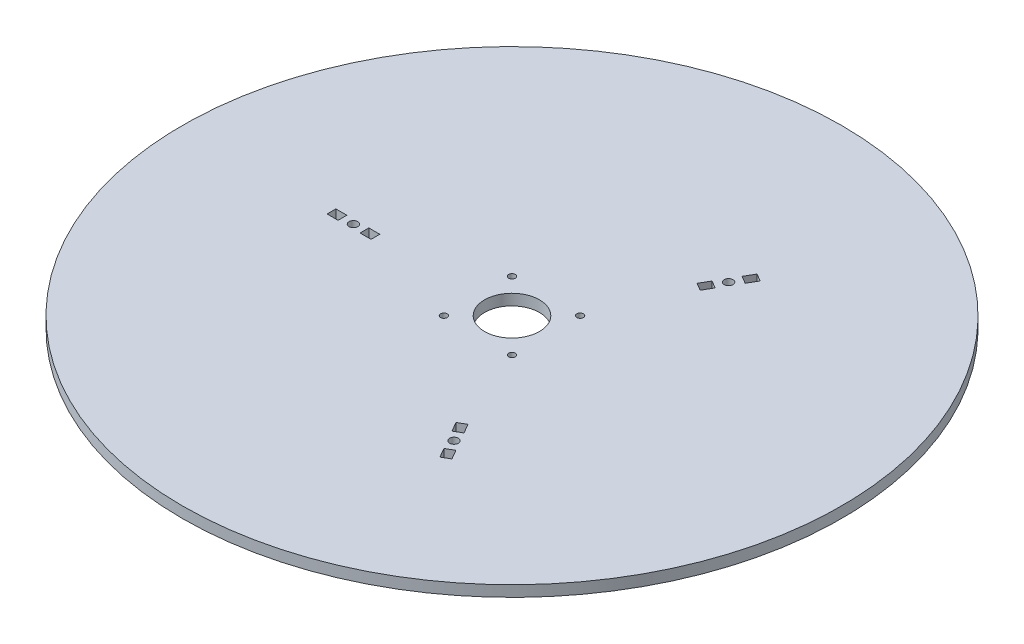
ISO-10303-21;
HEADER;
FILE_DESCRIPTION(('STEP AP214'),'2;1');
FILE_NAME('part.step','',(''),(''),'','','');
FILE_SCHEMA(('AUTOMOTIVE_DESIGN { 1 0 10303 214 1 1 1 1 }'));
ENDSEC;
DATA;
#1=APPLICATION_CONTEXT('core data for automotive mechanical design processes');
#2=APPLICATION_PROTOCOL_DEFINITION('international standard','automotive_design',2000,#1);
#3=PRODUCT_CONTEXT('',#1,'mechanical');
#4=PRODUCT('Part','Part','',(#3));
#5=PRODUCT_RELATED_PRODUCT_CATEGORY('part','',(#4));
#6=PRODUCT_DEFINITION_FORMATION('','',#4);
#7=PRODUCT_DEFINITION_CONTEXT('part definition',#1,'design');
#8=PRODUCT_DEFINITION('design','',#6,#7);
#9=PRODUCT_DEFINITION_SHAPE('','',#8);
#10=(LENGTH_UNIT() NAMED_UNIT(*) SI_UNIT(.MILLI.,.METRE.));
#11=(NAMED_UNIT(*) PLANE_ANGLE_UNIT() SI_UNIT($,.RADIAN.));
#12=(NAMED_UNIT(*) SI_UNIT($,.STERADIAN.) SOLID_ANGLE_UNIT());
#13=UNCERTAINTY_MEASURE_WITH_UNIT(LENGTH_MEASURE(1.E-05),#10,'distance_accuracy_value','');
#14=(GEOMETRIC_REPRESENTATION_CONTEXT(3) GLOBAL_UNCERTAINTY_ASSIGNED_CONTEXT((#13)) GLOBAL_UNIT_ASSIGNED_CONTEXT((#10,
#11,#12)) REPRESENTATION_CONTEXT('',''));
#15=CARTESIAN_POINT('',(0.,0.,0.));
#16=DIRECTION('',(0.,0.,1.));
#17=DIRECTION('',(1.,0.,0.));
#18=AXIS2_PLACEMENT_3D('',#15,#16,#17);
#19=CARTESIAN_POINT('',(0.,5.,0.));
#20=DIRECTION('',(0.,1.,0.));
#21=DIRECTION('',(0.,0.,1.));
#22=AXIS2_PLACEMENT_3D('',#19,#20,#21);
#23=PLANE('',#22);
#24=DIRECTION('',(-0.866025403784439,0.,-0.5));
#25=VECTOR('',#24,1.);
#26=CARTESIAN_POINT('',(39.3523410167827,5.,-72.1602540378444));
#27=LINE('',#26,#25);
#28=CARTESIAN_POINT('',(42.8164426319205,5.,-70.1602540378444));
#29=VERTEX_POINT('',#28);
#30=CARTESIAN_POINT('',(39.3523410167827,5.,-72.1602540378444));
#31=VERTEX_POINT('',#30);
#32=EDGE_CURVE('E273',#29,#31,#27,.T.);
#33=ORIENTED_EDGE('',*,*,#32,.F.);
#34=DIRECTION('',(0.5,0.,-0.866025403784439));
#35=VECTOR('',#34,1.);
#36=CARTESIAN_POINT('',(40.3164426319205,5.,-65.8301270189222));
#37=LINE('',#36,#35);
#38=CARTESIAN_POINT('',(40.3164426319205,5.,-65.8301270189222));
#39=VERTEX_POINT('',#38);
#40=EDGE_CURVE('E271',#39,#29,#37,.T.);
#41=ORIENTED_EDGE('',*,*,#40,.F.);
#42=DIRECTION('',(0.866025403784439,0.,0.5));
#43=VECTOR('',#42,1.);
#44=CARTESIAN_POINT('',(36.8523410167827,5.,-67.8301270189222));
#45=LINE('',#44,#43);
#46=CARTESIAN_POINT('',(36.8523410167827,5.,-67.8301270189222));
#47=VERTEX_POINT('',#46);
#48=EDGE_CURVE('E279',#47,#39,#45,.T.);
#49=ORIENTED_EDGE('',*,*,#48,.F.);
#50=DIRECTION('',(-0.5,0.,0.866025403784439));
#51=VECTOR('',#50,1.);
#52=CARTESIAN_POINT('',(36.8523410167827,5.,-67.8301270189222));
#53=LINE('',#52,#51);
#54=EDGE_CURVE('E276',#31,#47,#53,.T.);
#55=ORIENTED_EDGE('',*,*,#54,.F.);
#56=EDGE_LOOP('',(#33,#41,#49,#55));
#57=FACE_BOUND('',#56,.T.);
#58=DIRECTION('',(-0.866025403784438,0.,-0.500000000000001));
#59=VECTOR('',#58,1.);
#60=CARTESIAN_POINT('',(31.8523410167827,5.,-59.1698729810778));
#61=LINE('',#60,#59);
#62=CARTESIAN_POINT('',(35.3164426319205,5.,-57.1698729810778));
#63=VERTEX_POINT('',#62);
#64=CARTESIAN_POINT('',(31.8523410167827,5.,-59.1698729810778));
#65=VERTEX_POINT('',#64);
#66=EDGE_CURVE('E304',#63,#65,#61,.T.);
#67=ORIENTED_EDGE('',*,*,#66,.F.);
#68=DIRECTION('',(0.499999999999999,0.,-0.866025403784439));
#69=VECTOR('',#68,1.);
#70=CARTESIAN_POINT('',(32.8164426319205,5.,-52.8397459621556));
#71=LINE('',#70,#69);
#72=CARTESIAN_POINT('',(32.8164426319205,5.,-52.8397459621556));
#73=VERTEX_POINT('',#72);
#74=EDGE_CURVE('E302',#73,#63,#71,.T.);
#75=ORIENTED_EDGE('',*,*,#74,.F.);
#76=DIRECTION('',(0.866025403784439,0.,0.499999999999999));
#77=VECTOR('',#76,1.);
#78=CARTESIAN_POINT('',(29.3523410167827,5.,-54.8397459621556));
#79=LINE('',#78,#77);
#80=CARTESIAN_POINT('',(29.3523410167827,5.,-54.8397459621556));
#81=VERTEX_POINT('',#80);
#82=EDGE_CURVE('E310',#81,#73,#79,.T.);
#83=ORIENTED_EDGE('',*,*,#82,.F.);
#84=DIRECTION('',(-0.499999999999999,0.,0.866025403784439));
#85=VECTOR('',#84,1.);
#86=CARTESIAN_POINT('',(29.3523410167827,5.,-54.8397459621556));
#87=LINE('',#86,#85);
#88=EDGE_CURVE('E307',#65,#81,#87,.T.);
#89=ORIENTED_EDGE('',*,*,#88,.F.);
#90=EDGE_LOOP('',(#67,#75,#83,#89));
#91=FACE_BOUND('',#90,.T.);
#92=CARTESIAN_POINT('',(36.0843918243516,5.,-62.5));
#93=DIRECTION('',(0.,1.,0.));
#94=DIRECTION('',(0.,0.,1.));
#95=AXIS2_PLACEMENT_3D('',#92,#93,#94);
#96=CIRCLE('',#95,2.00000000000001);
#97=CARTESIAN_POINT('',(36.0843918243516,5.,-60.5));
#98=VERTEX_POINT('',#97);
#99=EDGE_CURVE('E333',#98,#98,#96,.T.);
#100=ORIENTED_EDGE('',*,*,#99,.F.);
#101=EDGE_LOOP('',(#100));
#102=FACE_BOUND('',#101,.T.);
#103=CARTESIAN_POINT('',(-15.5000000000002,5.,15.4999999999998));
#104=DIRECTION('',(0.,1.,0.));
#105=DIRECTION('',(0.,0.,1.));
#106=AXIS2_PLACEMENT_3D('',#103,#104,#105);
#107=CIRCLE('',#106,1.5);
#108=CARTESIAN_POINT('',(-15.5000000000002,5.,16.9999999999998));
#109=VERTEX_POINT('',#108);
#110=EDGE_CURVE('E407',#109,#109,#107,.T.);
#111=ORIENTED_EDGE('',*,*,#110,.F.);
#112=EDGE_LOOP('',(#111));
#113=FACE_BOUND('',#112,.T.);
#114=CARTESIAN_POINT('',(15.5,5.,-15.4999999999999));
#115=DIRECTION('',(0.,1.,0.));
#116=DIRECTION('',(0.,0.,1.));
#117=AXIS2_PLACEMENT_3D('',#114,#115,#116);
#118=CIRCLE('',#117,1.5);
#119=CARTESIAN_POINT('',(15.5,5.,-13.9999999999999));
#120=VERTEX_POINT('',#119);
#121=EDGE_CURVE('E419',#120,#120,#118,.T.);
#122=ORIENTED_EDGE('',*,*,#121,.F.);
#123=EDGE_LOOP('',(#122));
#124=FACE_BOUND('',#123,.T.);
#125=CARTESIAN_POINT('',(-15.5,5.,-15.5));
#126=DIRECTION('',(0.,1.,0.));
#127=DIRECTION('',(0.,0.,1.));
#128=AXIS2_PLACEMENT_3D('',#125,#126,#127);
#129=CIRCLE('',#128,1.5);
#130=CARTESIAN_POINT('',(-15.5,5.,-14.));
#131=VERTEX_POINT('',#130);
#132=EDGE_CURVE('E431',#131,#131,#129,.T.);
#133=ORIENTED_EDGE('',*,*,#132,.F.);
#134=EDGE_LOOP('',(#133));
#135=FACE_BOUND('',#134,.T.);
#136=CARTESIAN_POINT('',(0.,5.,0.));
#137=DIRECTION('',(0.,1.,0.));
#138=DIRECTION('',(0.,0.,1.));
#139=AXIS2_PLACEMENT_3D('',#136,#137,#138);
#140=CIRCLE('',#139,150.);
#141=CARTESIAN_POINT('',(0.,5.,150.));
#142=VERTEX_POINT('',#141);
#143=EDGE_CURVE('E11',#142,#142,#140,.T.);
#144=ORIENTED_EDGE('',*,*,#143,.T.);
#145=EDGE_LOOP('',(#144));
#146=FACE_BOUND('',#145,.T.);
#147=CARTESIAN_POINT('',(0.,5.,0.));
#148=DIRECTION('',(0.,1.,0.));
#149=DIRECTION('',(0.,0.,1.));
#150=AXIS2_PLACEMENT_3D('',#147,#148,#149);
#151=CIRCLE('',#150,12.5);
#152=CARTESIAN_POINT('',(0.,5.,12.5));
#153=VERTEX_POINT('',#152);
#154=EDGE_CURVE('E425',#153,#153,#151,.T.);
#155=ORIENTED_EDGE('',*,*,#154,.F.);
#156=EDGE_LOOP('',(#155));
#157=FACE_BOUND('',#156,.T.);
#158=CARTESIAN_POINT('',(15.4999999999999,5.,15.5000000000001));
#159=DIRECTION('',(0.,1.,0.));
#160=DIRECTION('',(0.,0.,1.));
#161=AXIS2_PLACEMENT_3D('',#158,#159,#160);
#162=CIRCLE('',#161,1.5);
#163=CARTESIAN_POINT('',(15.4999999999999,5.,17.0000000000001));
#164=VERTEX_POINT('',#163);
#165=EDGE_CURVE('E413',#164,#164,#162,.T.);
#166=ORIENTED_EDGE('',*,*,#165,.F.);
#167=EDGE_LOOP('',(#166));
#168=FACE_BOUND('',#167,.T.);
#169=CARTESIAN_POINT('',(-72.1687836487032,5.,0.));
#170=DIRECTION('',(0.,1.,0.));
#171=DIRECTION('',(0.,0.,1.));
#172=AXIS2_PLACEMENT_3D('',#169,#170,#171);
#173=CIRCLE('',#172,2.);
#174=CARTESIAN_POINT('',(-72.1687836487032,5.,1.99999999999998));
#175=VERTEX_POINT('',#174);
#176=EDGE_CURVE('E401',#175,#175,#173,.T.);
#177=ORIENTED_EDGE('',*,*,#176,.F.);
#178=EDGE_LOOP('',(#177));
#179=FACE_BOUND('',#178,.T.);
#180=DIRECTION('',(1.,0.,0.));
#181=VECTOR('',#180,1.);
#182=CARTESIAN_POINT('',(-62.1687836487032,5.,2.));
#183=LINE('',#182,#181);
#184=CARTESIAN_POINT('',(-67.1687836487032,5.,2.));
#185=VERTEX_POINT('',#184);
#186=CARTESIAN_POINT('',(-62.1687836487032,5.,2.));
#187=VERTEX_POINT('',#186);
#188=EDGE_CURVE('E372',#185,#187,#183,.T.);
#189=ORIENTED_EDGE('',*,*,#188,.F.);
#190=DIRECTION('',(0.,0.,1.));
#191=VECTOR('',#190,1.);
#192=CARTESIAN_POINT('',(-67.1687836487032,5.,2.));
#193=LINE('',#192,#191);
#194=CARTESIAN_POINT('',(-67.1687836487032,5.,-2.));
#195=VERTEX_POINT('',#194);
#196=EDGE_CURVE('E370',#195,#185,#193,.T.);
#197=ORIENTED_EDGE('',*,*,#196,.F.);
#198=DIRECTION('',(-1.,0.,0.));
#199=VECTOR('',#198,1.);
#200=CARTESIAN_POINT('',(-62.1687836487032,5.,-2.));
#201=LINE('',#200,#199);
#202=CARTESIAN_POINT('',(-62.1687836487032,5.,-2.));
#203=VERTEX_POINT('',#202);
#204=EDGE_CURVE('E378',#203,#195,#201,.T.);
#205=ORIENTED_EDGE('',*,*,#204,.F.);
#206=DIRECTION('',(0.,0.,-1.));
#207=VECTOR('',#206,1.);
#208=CARTESIAN_POINT('',(-62.1687836487032,5.,2.));
#209=LINE('',#208,#207);
#210=EDGE_CURVE('E375',#187,#203,#209,.T.);
#211=ORIENTED_EDGE('',*,*,#210,.F.);
#212=EDGE_LOOP('',(#189,#197,#205,#211));
#213=FACE_BOUND('',#212,.T.);
#214=DIRECTION('',(1.,0.,0.));
#215=VECTOR('',#214,1.);
#216=CARTESIAN_POINT('',(-77.1687836487032,5.,1.99999999999999));
#217=LINE('',#216,#215);
#218=CARTESIAN_POINT('',(-82.1687836487032,5.,1.99999999999999));
#219=VERTEX_POINT('',#218);
#220=CARTESIAN_POINT('',(-77.1687836487032,5.,1.99999999999999));
#221=VERTEX_POINT('',#220);
#222=EDGE_CURVE('E341',#219,#221,#217,.T.);
#223=ORIENTED_EDGE('',*,*,#222,.F.);
#224=DIRECTION('',(0.,0.,1.));
#225=VECTOR('',#224,1.);
#226=CARTESIAN_POINT('',(-82.1687836487032,5.,1.99999999999999));
#227=LINE('',#226,#225);
#228=CARTESIAN_POINT('',(-82.1687836487032,5.,-2.00000000000001));
#229=VERTEX_POINT('',#228);
#230=EDGE_CURVE('E339',#229,#219,#227,.T.);
#231=ORIENTED_EDGE('',*,*,#230,.F.);
#232=DIRECTION('',(-1.,0.,0.));
#233=VECTOR('',#232,1.);
#234=CARTESIAN_POINT('',(-77.1687836487032,5.,-2.00000000000001));
#235=LINE('',#234,#233);
#236=CARTESIAN_POINT('',(-77.1687836487032,5.,-2.00000000000001));
#237=VERTEX_POINT('',#236);
#238=EDGE_CURVE('E347',#237,#229,#235,.T.);
#239=ORIENTED_EDGE('',*,*,#238,.F.);
#240=DIRECTION('',(0.,0.,-1.));
#241=VECTOR('',#240,1.);
#242=CARTESIAN_POINT('',(-77.1687836487032,5.,1.99999999999999));
#243=LINE('',#242,#241);
#244=EDGE_CURVE('E344',#221,#237,#243,.T.);
#245=ORIENTED_EDGE('',*,*,#244,.F.);
#246=EDGE_LOOP('',(#223,#231,#239,#245));
#247=FACE_BOUND('',#246,.T.);
#248=CARTESIAN_POINT('',(36.0843918243516,5.,62.5));
#249=DIRECTION('',(0.,1.,0.));
#250=DIRECTION('',(0.,0.,1.));
#251=AXIS2_PLACEMENT_3D('',#248,#249,#250);
#252=CIRCLE('',#251,2.00000000000001);
#253=CARTESIAN_POINT('',(36.0843918243516,5.,64.5));
#254=VERTEX_POINT('',#253);
#255=EDGE_CURVE('E265',#254,#254,#252,.T.);
#256=ORIENTED_EDGE('',*,*,#255,.F.);
#257=EDGE_LOOP('',(#256));
#258=FACE_BOUND('',#257,.T.);
#259=DIRECTION('',(0.866025403784438,0.,-0.500000000000001));
#260=VECTOR('',#259,1.);
#261=CARTESIAN_POINT('',(35.3164426319205,5.,57.1698729810778));
#262=LINE('',#261,#260);
#263=CARTESIAN_POINT('',(31.8523410167828,5.,59.1698729810778));
#264=VERTEX_POINT('',#263);
#265=CARTESIAN_POINT('',(35.3164426319205,5.,57.1698729810778));
#266=VERTEX_POINT('',#265);
#267=EDGE_CURVE('E236',#264,#266,#262,.T.);
#268=ORIENTED_EDGE('',*,*,#267,.F.);
#269=DIRECTION('',(0.5,0.,0.866025403784439));
#270=VECTOR('',#269,1.);
#271=CARTESIAN_POINT('',(29.3523410167828,5.,54.8397459621556));
#272=LINE('',#271,#270);
#273=CARTESIAN_POINT('',(29.3523410167828,5.,54.8397459621556));
#274=VERTEX_POINT('',#273);
#275=EDGE_CURVE('E234',#274,#264,#272,.T.);
#276=ORIENTED_EDGE('',*,*,#275,.F.);
#277=DIRECTION('',(-0.866025403784438,0.,0.5));
#278=VECTOR('',#277,1.);
#279=CARTESIAN_POINT('',(32.8164426319205,5.,52.8397459621556));
#280=LINE('',#279,#278);
#281=CARTESIAN_POINT('',(32.8164426319205,5.,52.8397459621556));
#282=VERTEX_POINT('',#281);
#283=EDGE_CURVE('E242',#282,#274,#280,.T.);
#284=ORIENTED_EDGE('',*,*,#283,.F.);
#285=DIRECTION('',(-0.5,0.,-0.866025403784439));
#286=VECTOR('',#285,1.);
#287=CARTESIAN_POINT('',(32.8164426319205,5.,52.8397459621556));
#288=LINE('',#287,#286);
#289=EDGE_CURVE('E239',#266,#282,#288,.T.);
#290=ORIENTED_EDGE('',*,*,#289,.F.);
#291=EDGE_LOOP('',(#268,#276,#284,#290));
#292=FACE_BOUND('',#291,.T.);
#293=DIRECTION('',(0.866025403784439,0.,-0.5));
#294=VECTOR('',#293,1.);
#295=CARTESIAN_POINT('',(42.8164426319205,5.,70.1602540378444));
#296=LINE('',#295,#294);
#297=CARTESIAN_POINT('',(39.3523410167828,5.,72.1602540378444));
#298=VERTEX_POINT('',#297);
#299=CARTESIAN_POINT('',(42.8164426319205,5.,70.1602540378444));
#300=VERTEX_POINT('',#299);
#301=EDGE_CURVE('E206',#298,#300,#296,.T.);
#302=ORIENTED_EDGE('',*,*,#301,.F.);
#303=DIRECTION('',(0.5,0.,0.866025403784439));
#304=VECTOR('',#303,1.);
#305=CARTESIAN_POINT('',(36.8523410167828,5.,67.8301270189222));
#306=LINE('',#305,#304);
#307=CARTESIAN_POINT('',(36.8523410167828,5.,67.8301270189222));
#308=VERTEX_POINT('',#307);
#309=EDGE_CURVE('E198',#308,#298,#306,.T.);
#310=ORIENTED_EDGE('',*,*,#309,.F.);
#311=DIRECTION('',(-0.866025403784439,0.,0.5));
#312=VECTOR('',#311,1.);
#313=CARTESIAN_POINT('',(40.3164426319205,5.,65.8301270189222));
#314=LINE('',#313,#312);
#315=CARTESIAN_POINT('',(40.3164426319205,5.,65.8301270189222));
#316=VERTEX_POINT('',#315);
#317=EDGE_CURVE('E220',#316,#308,#314,.T.);
#318=ORIENTED_EDGE('',*,*,#317,.F.);
#319=DIRECTION('',(-0.5,0.,-0.866025403784439));
#320=VECTOR('',#319,1.);
#321=CARTESIAN_POINT('',(40.3164426319205,5.,65.8301270189222));
#322=LINE('',#321,#320);
#323=EDGE_CURVE('E218',#300,#316,#322,.T.);
#324=ORIENTED_EDGE('',*,*,#323,.F.);
#325=EDGE_LOOP('',(#302,#310,#318,#324));
#326=FACE_BOUND('',#325,.T.);
#327=ADVANCED_FACE('F37',(#57,#91,#102,#113,#124,#135,#146,#157,#168,#179,#213,#247,#258,#292,
#326),#23,.T.);
#328=CARTESIAN_POINT('',(0.,0.,0.));
#329=DIRECTION('',(0.,1.,0.));
#330=DIRECTION('',(0.,0.,1.));
#331=AXIS2_PLACEMENT_3D('',#328,#329,#330);
#332=PLANE('',#331);
#333=DIRECTION('',(0.5,0.,0.866025403784439));
#334=VECTOR('',#333,1.);
#335=CARTESIAN_POINT('',(29.3523410167828,0.,54.8397459621556));
#336=LINE('',#335,#334);
#337=CARTESIAN_POINT('',(29.3523410167828,0.,54.8397459621556));
#338=VERTEX_POINT('',#337);
#339=CARTESIAN_POINT('',(31.8523410167828,0.,59.1698729810778));
#340=VERTEX_POINT('',#339);
#341=EDGE_CURVE('E214',#338,#340,#336,.T.);
#342=ORIENTED_EDGE('',*,*,#341,.T.);
#343=DIRECTION('',(0.866025403784438,0.,-0.500000000000001));
#344=VECTOR('',#343,1.);
#345=CARTESIAN_POINT('',(35.3164426319205,0.,57.1698729810778));
#346=LINE('',#345,#344);
#347=CARTESIAN_POINT('',(35.3164426319205,0.,57.1698729810778));
#348=VERTEX_POINT('',#347);
#349=EDGE_CURVE('E247',#340,#348,#346,.T.);
#350=ORIENTED_EDGE('',*,*,#349,.T.);
#351=DIRECTION('',(-0.5,0.,-0.866025403784439));
#352=VECTOR('',#351,1.);
#353=CARTESIAN_POINT('',(32.8164426319205,0.,52.8397459621556));
#354=LINE('',#353,#352);
#355=CARTESIAN_POINT('',(32.8164426319205,0.,52.8397459621556));
#356=VERTEX_POINT('',#355);
#357=EDGE_CURVE('E250',#348,#356,#354,.T.);
#358=ORIENTED_EDGE('',*,*,#357,.T.);
#359=DIRECTION('',(-0.866025403784438,0.,0.5));
#360=VECTOR('',#359,1.);
#361=CARTESIAN_POINT('',(32.8164426319205,0.,52.8397459621556));
#362=LINE('',#361,#360);
#363=EDGE_CURVE('E237',#356,#338,#362,.T.);
#364=ORIENTED_EDGE('',*,*,#363,.T.);
#365=EDGE_LOOP('',(#342,#350,#358,#364));
#366=FACE_BOUND('',#365,.T.);
#367=DIRECTION('',(0.499999999999999,0.,-0.866025403784439));
#368=VECTOR('',#367,1.);
#369=CARTESIAN_POINT('',(32.8164426319205,0.,-52.8397459621556));
#370=LINE('',#369,#368);
#371=CARTESIAN_POINT('',(32.8164426319205,0.,-52.8397459621556));
#372=VERTEX_POINT('',#371);
#373=CARTESIAN_POINT('',(35.3164426319205,0.,-57.1698729810778));
#374=VERTEX_POINT('',#373);
#375=EDGE_CURVE('E301',#372,#374,#370,.T.);
#376=ORIENTED_EDGE('',*,*,#375,.T.);
#377=DIRECTION('',(-0.866025403784438,0.,-0.500000000000001));
#378=VECTOR('',#377,1.);
#379=CARTESIAN_POINT('',(31.8523410167827,0.,-59.1698729810778));
#380=LINE('',#379,#378);
#381=CARTESIAN_POINT('',(31.8523410167827,0.,-59.1698729810778));
#382=VERTEX_POINT('',#381);
#383=EDGE_CURVE('E315',#374,#382,#380,.T.);
#384=ORIENTED_EDGE('',*,*,#383,.T.);
#385=DIRECTION('',(-0.499999999999999,0.,0.866025403784439));
#386=VECTOR('',#385,1.);
#387=CARTESIAN_POINT('',(29.3523410167827,0.,-54.8397459621556));
#388=LINE('',#387,#386);
#389=CARTESIAN_POINT('',(29.3523410167827,0.,-54.8397459621556));
#390=VERTEX_POINT('',#389);
#391=EDGE_CURVE('E318',#382,#390,#388,.T.);
#392=ORIENTED_EDGE('',*,*,#391,.T.);
#393=DIRECTION('',(0.866025403784439,0.,0.499999999999999));
#394=VECTOR('',#393,1.);
#395=CARTESIAN_POINT('',(29.3523410167827,0.,-54.8397459621556));
#396=LINE('',#395,#394);
#397=EDGE_CURVE('E305',#390,#372,#396,.T.);
#398=ORIENTED_EDGE('',*,*,#397,.T.);
#399=EDGE_LOOP('',(#376,#384,#392,#398));
#400=FACE_BOUND('',#399,.T.);
#401=DIRECTION('',(0.,0.,1.));
#402=VECTOR('',#401,1.);
#403=CARTESIAN_POINT('',(-67.1687836487032,0.,2.));
#404=LINE('',#403,#402);
#405=CARTESIAN_POINT('',(-67.1687836487032,0.,-2.));
#406=VERTEX_POINT('',#405);
#407=CARTESIAN_POINT('',(-67.1687836487032,0.,2.));
#408=VERTEX_POINT('',#407);
#409=EDGE_CURVE('E369',#406,#408,#404,.T.);
#410=ORIENTED_EDGE('',*,*,#409,.T.);
#411=DIRECTION('',(1.,0.,0.));
#412=VECTOR('',#411,1.);
#413=CARTESIAN_POINT('',(-62.1687836487032,0.,2.));
#414=LINE('',#413,#412);
#415=CARTESIAN_POINT('',(-62.1687836487032,0.,2.));
#416=VERTEX_POINT('',#415);
#417=EDGE_CURVE('E383',#408,#416,#414,.T.);
#418=ORIENTED_EDGE('',*,*,#417,.T.);
#419=DIRECTION('',(0.,0.,-1.));
#420=VECTOR('',#419,1.);
#421=CARTESIAN_POINT('',(-62.1687836487032,0.,2.));
#422=LINE('',#421,#420);
#423=CARTESIAN_POINT('',(-62.1687836487032,0.,-2.));
#424=VERTEX_POINT('',#423);
#425=EDGE_CURVE('E386',#416,#424,#422,.T.);
#426=ORIENTED_EDGE('',*,*,#425,.T.);
#427=DIRECTION('',(-1.,0.,0.));
#428=VECTOR('',#427,1.);
#429=CARTESIAN_POINT('',(-62.1687836487032,0.,-2.));
#430=LINE('',#429,#428);
#431=EDGE_CURVE('E373',#424,#406,#430,.T.);
#432=ORIENTED_EDGE('',*,*,#431,.T.);
#433=EDGE_LOOP('',(#410,#418,#426,#432));
#434=FACE_BOUND('',#433,.T.);
#435=CARTESIAN_POINT('',(0.,0.,0.));
#436=DIRECTION('',(0.,1.,0.));
#437=DIRECTION('',(0.,0.,1.));
#438=AXIS2_PLACEMENT_3D('',#435,#436,#437);
#439=CIRCLE('',#438,150.);
#440=CARTESIAN_POINT('',(0.,0.,150.));
#441=VERTEX_POINT('',#440);
#442=EDGE_CURVE('E41',#441,#441,#439,.T.);
#443=ORIENTED_EDGE('',*,*,#442,.F.);
#444=EDGE_LOOP('',(#443));
#445=FACE_BOUND('',#444,.T.);
#446=CARTESIAN_POINT('',(-15.5,0.,-15.5));
#447=DIRECTION('',(0.,1.,0.));
#448=DIRECTION('',(0.,0.,1.));
#449=AXIS2_PLACEMENT_3D('',#446,#447,#448);
#450=CIRCLE('',#449,1.5);
#451=CARTESIAN_POINT('',(-15.5,0.,-14.));
#452=VERTEX_POINT('',#451);
#453=EDGE_CURVE('E428',#452,#452,#450,.T.);
#454=ORIENTED_EDGE('',*,*,#453,.T.);
#455=EDGE_LOOP('',(#454));
#456=FACE_BOUND('',#455,.T.);
#457=CARTESIAN_POINT('',(0.,0.,0.));
#458=DIRECTION('',(0.,1.,0.));
#459=DIRECTION('',(0.,0.,1.));
#460=AXIS2_PLACEMENT_3D('',#457,#458,#459);
#461=CIRCLE('',#460,12.5);
#462=CARTESIAN_POINT('',(0.,0.,12.5));
#463=VERTEX_POINT('',#462);
#464=EDGE_CURVE('E422',#463,#463,#461,.T.);
#465=ORIENTED_EDGE('',*,*,#464,.T.);
#466=EDGE_LOOP('',(#465));
#467=FACE_BOUND('',#466,.T.);
#468=CARTESIAN_POINT('',(15.5,0.,-15.4999999999999));
#469=DIRECTION('',(0.,1.,0.));
#470=DIRECTION('',(0.,0.,1.));
#471=AXIS2_PLACEMENT_3D('',#468,#469,#470);
#472=CIRCLE('',#471,1.5);
#473=CARTESIAN_POINT('',(15.5,0.,-13.9999999999999));
#474=VERTEX_POINT('',#473);
#475=EDGE_CURVE('E416',#474,#474,#472,.T.);
#476=ORIENTED_EDGE('',*,*,#475,.T.);
#477=EDGE_LOOP('',(#476));
#478=FACE_BOUND('',#477,.T.);
#479=CARTESIAN_POINT('',(15.4999999999999,0.,15.5000000000001));
#480=DIRECTION('',(0.,1.,0.));
#481=DIRECTION('',(0.,0.,1.));
#482=AXIS2_PLACEMENT_3D('',#479,#480,#481);
#483=CIRCLE('',#482,1.5);
#484=CARTESIAN_POINT('',(15.4999999999999,0.,17.0000000000001));
#485=VERTEX_POINT('',#484);
#486=EDGE_CURVE('E410',#485,#485,#483,.T.);
#487=ORIENTED_EDGE('',*,*,#486,.T.);
#488=EDGE_LOOP('',(#487));
#489=FACE_BOUND('',#488,.T.);
#490=CARTESIAN_POINT('',(-15.5000000000002,0.,15.4999999999998));
#491=DIRECTION('',(0.,1.,0.));
#492=DIRECTION('',(0.,0.,1.));
#493=AXIS2_PLACEMENT_3D('',#490,#491,#492);
#494=CIRCLE('',#493,1.5);
#495=CARTESIAN_POINT('',(-15.5000000000002,0.,16.9999999999998));
#496=VERTEX_POINT('',#495);
#497=EDGE_CURVE('E404',#496,#496,#494,.T.);
#498=ORIENTED_EDGE('',*,*,#497,.T.);
#499=EDGE_LOOP('',(#498));
#500=FACE_BOUND('',#499,.T.);
#501=CARTESIAN_POINT('',(-72.1687836487032,0.,0.));
#502=DIRECTION('',(0.,1.,0.));
#503=DIRECTION('',(0.,0.,1.));
#504=AXIS2_PLACEMENT_3D('',#501,#502,#503);
#505=CIRCLE('',#504,2.);
#506=CARTESIAN_POINT('',(-72.1687836487032,0.,1.99999999999998));
#507=VERTEX_POINT('',#506);
#508=EDGE_CURVE('E400',#507,#507,#505,.T.);
#509=ORIENTED_EDGE('',*,*,#508,.T.);
#510=EDGE_LOOP('',(#509));
#511=FACE_BOUND('',#510,.T.);
#512=DIRECTION('',(0.,0.,1.));
#513=VECTOR('',#512,1.);
#514=CARTESIAN_POINT('',(-82.1687836487032,0.,1.99999999999999));
#515=LINE('',#514,#513);
#516=CARTESIAN_POINT('',(-82.1687836487032,0.,-2.00000000000001));
#517=VERTEX_POINT('',#516);
#518=CARTESIAN_POINT('',(-82.1687836487032,0.,1.99999999999999));
#519=VERTEX_POINT('',#518);
#520=EDGE_CURVE('E336',#517,#519,#515,.T.);
#521=ORIENTED_EDGE('',*,*,#520,.T.);
#522=DIRECTION('',(1.,0.,0.));
#523=VECTOR('',#522,1.);
#524=CARTESIAN_POINT('',(-77.1687836487032,0.,1.99999999999999));
#525=LINE('',#524,#523);
#526=CARTESIAN_POINT('',(-77.1687836487032,0.,1.99999999999999));
#527=VERTEX_POINT('',#526);
#528=EDGE_CURVE('E352',#519,#527,#525,.T.);
#529=ORIENTED_EDGE('',*,*,#528,.T.);
#530=DIRECTION('',(0.,0.,-1.));
#531=VECTOR('',#530,1.);
#532=CARTESIAN_POINT('',(-77.1687836487032,0.,1.99999999999999));
#533=LINE('',#532,#531);
#534=CARTESIAN_POINT('',(-77.1687836487032,0.,-2.00000000000001));
#535=VERTEX_POINT('',#534);
#536=EDGE_CURVE('E355',#527,#535,#533,.T.);
#537=ORIENTED_EDGE('',*,*,#536,.T.);
#538=DIRECTION('',(-1.,0.,0.));
#539=VECTOR('',#538,1.);
#540=CARTESIAN_POINT('',(-77.1687836487032,0.,-2.00000000000001));
#541=LINE('',#540,#539);
#542=EDGE_CURVE('E342',#535,#517,#541,.T.);
#543=ORIENTED_EDGE('',*,*,#542,.T.);
#544=EDGE_LOOP('',(#521,#529,#537,#543));
#545=FACE_BOUND('',#544,.T.);
#546=CARTESIAN_POINT('',(36.0843918243516,0.,-62.5));
#547=DIRECTION('',(0.,1.,0.));
#548=DIRECTION('',(0.,0.,1.));
#549=AXIS2_PLACEMENT_3D('',#546,#547,#548);
#550=CIRCLE('',#549,2.00000000000001);
#551=CARTESIAN_POINT('',(36.0843918243516,0.,-60.5));
#552=VERTEX_POINT('',#551);
#553=EDGE_CURVE('E332',#552,#552,#550,.T.);
#554=ORIENTED_EDGE('',*,*,#553,.T.);
#555=EDGE_LOOP('',(#554));
#556=FACE_BOUND('',#555,.T.);
#557=DIRECTION('',(0.5,0.,-0.866025403784439));
#558=VECTOR('',#557,1.);
#559=CARTESIAN_POINT('',(40.3164426319205,0.,-65.8301270189222));
#560=LINE('',#559,#558);
#561=CARTESIAN_POINT('',(40.3164426319205,0.,-65.8301270189222));
#562=VERTEX_POINT('',#561);
#563=CARTESIAN_POINT('',(42.8164426319205,0.,-70.1602540378444));
#564=VERTEX_POINT('',#563);
#565=EDGE_CURVE('E268',#562,#564,#560,.T.);
#566=ORIENTED_EDGE('',*,*,#565,.T.);
#567=DIRECTION('',(-0.866025403784439,0.,-0.5));
#568=VECTOR('',#567,1.);
#569=CARTESIAN_POINT('',(39.3523410167827,0.,-72.1602540378444));
#570=LINE('',#569,#568);
#571=CARTESIAN_POINT('',(39.3523410167827,0.,-72.1602540378444));
#572=VERTEX_POINT('',#571);
#573=EDGE_CURVE('E284',#564,#572,#570,.T.);
#574=ORIENTED_EDGE('',*,*,#573,.T.);
#575=DIRECTION('',(-0.5,0.,0.866025403784439));
#576=VECTOR('',#575,1.);
#577=CARTESIAN_POINT('',(36.8523410167827,0.,-67.8301270189222));
#578=LINE('',#577,#576);
#579=CARTESIAN_POINT('',(36.8523410167827,0.,-67.8301270189222));
#580=VERTEX_POINT('',#579);
#581=EDGE_CURVE('E287',#572,#580,#578,.T.);
#582=ORIENTED_EDGE('',*,*,#581,.T.);
#583=DIRECTION('',(0.866025403784439,0.,0.5));
#584=VECTOR('',#583,1.);
#585=CARTESIAN_POINT('',(36.8523410167827,0.,-67.8301270189222));
#586=LINE('',#585,#584);
#587=EDGE_CURVE('E274',#580,#562,#586,.T.);
#588=ORIENTED_EDGE('',*,*,#587,.T.);
#589=EDGE_LOOP('',(#566,#574,#582,#588));
#590=FACE_BOUND('',#589,.T.);
#591=CARTESIAN_POINT('',(36.0843918243516,0.,62.5));
#592=DIRECTION('',(0.,1.,0.));
#593=DIRECTION('',(0.,0.,1.));
#594=AXIS2_PLACEMENT_3D('',#591,#592,#593);
#595=CIRCLE('',#594,2.00000000000001);
#596=CARTESIAN_POINT('',(36.0843918243516,0.,64.5));
#597=VERTEX_POINT('',#596);
#598=EDGE_CURVE('E264',#597,#597,#595,.T.);
#599=ORIENTED_EDGE('',*,*,#598,.T.);
#600=EDGE_LOOP('',(#599));
#601=FACE_BOUND('',#600,.T.);
#602=DIRECTION('',(0.5,0.,0.866025403784439));
#603=VECTOR('',#602,1.);
#604=CARTESIAN_POINT('',(36.8523410167828,0.,67.8301270189222));
#605=LINE('',#604,#603);
#606=CARTESIAN_POINT('',(36.8523410167828,0.,67.8301270189222));
#607=VERTEX_POINT('',#606);
#608=CARTESIAN_POINT('',(39.3523410167828,0.,72.1602540378444));
#609=VERTEX_POINT('',#608);
#610=EDGE_CURVE('E60',#607,#609,#605,.T.);
#611=ORIENTED_EDGE('',*,*,#610,.T.);
#612=DIRECTION('',(0.866025403784439,0.,-0.5));
#613=VECTOR('',#612,1.);
#614=CARTESIAN_POINT('',(42.8164426319205,0.,70.1602540378444));
#615=LINE('',#614,#613);
#616=CARTESIAN_POINT('',(42.8164426319205,0.,70.1602540378444));
#617=VERTEX_POINT('',#616);
#618=EDGE_CURVE('E213',#609,#617,#615,.T.);
#619=ORIENTED_EDGE('',*,*,#618,.T.);
#620=DIRECTION('',(-0.5,0.,-0.866025403784439));
#621=VECTOR('',#620,1.);
#622=CARTESIAN_POINT('',(40.3164426319205,0.,65.8301270189222));
#623=LINE('',#622,#621);
#624=CARTESIAN_POINT('',(40.3164426319205,0.,65.8301270189222));
#625=VERTEX_POINT('',#624);
#626=EDGE_CURVE('E226',#617,#625,#623,.T.);
#627=ORIENTED_EDGE('',*,*,#626,.T.);
#628=DIRECTION('',(-0.866025403784439,0.,0.5));
#629=VECTOR('',#628,1.);
#630=CARTESIAN_POINT('',(40.3164426319205,0.,65.8301270189222));
#631=LINE('',#630,#629);
#632=EDGE_CURVE('E207',#625,#607,#631,.T.);
#633=ORIENTED_EDGE('',*,*,#632,.T.);
#634=EDGE_LOOP('',(#611,#619,#627,#633));
#635=FACE_BOUND('',#634,.T.);
#636=ADVANCED_FACE('F437',(#366,#400,#434,#445,#456,#467,#478,#489,#500,#511,#545,#556,#590,
#601,#635),#332,.F.);
#637=CARTESIAN_POINT('',(0.,5.,0.));
#638=DIRECTION('',(0.,-1.,0.));
#639=DIRECTION('',(0.,0.,-1.));
#640=AXIS2_PLACEMENT_3D('',#637,#638,#639);
#641=CYLINDRICAL_SURFACE('',#640,150.);
#642=ORIENTED_EDGE('',*,*,#143,.F.);
#643=EDGE_LOOP('',(#642));
#644=FACE_BOUND('',#643,.T.);
#645=ORIENTED_EDGE('',*,*,#442,.T.);
#646=EDGE_LOOP('',(#645));
#647=FACE_BOUND('',#646,.T.);
#648=ADVANCED_FACE('F39',(#644,#647),#641,.T.);
#649=CARTESIAN_POINT('',(-15.5,5.,-15.5));
#650=DIRECTION('',(0.,-1.,0.));
#651=DIRECTION('',(0.,0.,-1.));
#652=AXIS2_PLACEMENT_3D('',#649,#650,#651);
#653=CYLINDRICAL_SURFACE('',#652,1.5);
#654=ORIENTED_EDGE('',*,*,#132,.T.);
#655=EDGE_LOOP('',(#654));
#656=FACE_BOUND('',#655,.T.);
#657=ORIENTED_EDGE('',*,*,#453,.F.);
#658=EDGE_LOOP('',(#657));
#659=FACE_BOUND('',#658,.T.);
#660=ADVANCED_FACE('F440',(#656,#659),#653,.F.);
#661=CARTESIAN_POINT('',(0.,5.,0.));
#662=DIRECTION('',(0.,-1.,0.));
#663=DIRECTION('',(0.,0.,-1.));
#664=AXIS2_PLACEMENT_3D('',#661,#662,#663);
#665=CYLINDRICAL_SURFACE('',#664,12.5);
#666=ORIENTED_EDGE('',*,*,#154,.T.);
#667=EDGE_LOOP('',(#666));
#668=FACE_BOUND('',#667,.T.);
#669=ORIENTED_EDGE('',*,*,#464,.F.);
#670=EDGE_LOOP('',(#669));
#671=FACE_BOUND('',#670,.T.);
#672=ADVANCED_FACE('F442',(#668,#671),#665,.F.);
#673=CARTESIAN_POINT('',(15.5,5.,-15.4999999999999));
#674=DIRECTION('',(0.,-1.,0.));
#675=DIRECTION('',(0.,0.,-1.));
#676=AXIS2_PLACEMENT_3D('',#673,#674,#675);
#677=CYLINDRICAL_SURFACE('',#676,1.5);
#678=ORIENTED_EDGE('',*,*,#121,.T.);
#679=EDGE_LOOP('',(#678));
#680=FACE_BOUND('',#679,.T.);
#681=ORIENTED_EDGE('',*,*,#475,.F.);
#682=EDGE_LOOP('',(#681));
#683=FACE_BOUND('',#682,.T.);
#684=ADVANCED_FACE('F449',(#680,#683),#677,.F.);
#685=CARTESIAN_POINT('',(15.4999999999999,5.,15.5000000000001));
#686=DIRECTION('',(0.,-1.,0.));
#687=DIRECTION('',(0.,0.,-1.));
#688=AXIS2_PLACEMENT_3D('',#685,#686,#687);
#689=CYLINDRICAL_SURFACE('',#688,1.5);
#690=ORIENTED_EDGE('',*,*,#165,.T.);
#691=EDGE_LOOP('',(#690));
#692=FACE_BOUND('',#691,.T.);
#693=ORIENTED_EDGE('',*,*,#486,.F.);
#694=EDGE_LOOP('',(#693));
#695=FACE_BOUND('',#694,.T.);
#696=ADVANCED_FACE('F605',(#692,#695),#689,.F.);
#697=CARTESIAN_POINT('',(-15.5000000000002,5.,15.4999999999998));
#698=DIRECTION('',(0.,-1.,0.));
#699=DIRECTION('',(0.,0.,-1.));
#700=AXIS2_PLACEMENT_3D('',#697,#698,#699);
#701=CYLINDRICAL_SURFACE('',#700,1.5);
#702=ORIENTED_EDGE('',*,*,#110,.T.);
#703=EDGE_LOOP('',(#702));
#704=FACE_BOUND('',#703,.T.);
#705=ORIENTED_EDGE('',*,*,#497,.F.);
#706=EDGE_LOOP('',(#705));
#707=FACE_BOUND('',#706,.T.);
#708=ADVANCED_FACE('F601',(#704,#707),#701,.F.);
#709=CARTESIAN_POINT('',(-72.1687836487032,5.,0.));
#710=DIRECTION('',(0.,-1.,0.));
#711=DIRECTION('',(0.,0.,-1.));
#712=AXIS2_PLACEMENT_3D('',#709,#710,#711);
#713=CYLINDRICAL_SURFACE('',#712,2.);
#714=ORIENTED_EDGE('',*,*,#176,.T.);
#715=EDGE_LOOP('',(#714));
#716=FACE_BOUND('',#715,.T.);
#717=ORIENTED_EDGE('',*,*,#508,.F.);
#718=EDGE_LOOP('',(#717));
#719=FACE_BOUND('',#718,.T.);
#720=ADVANCED_FACE('F597',(#716,#719),#713,.F.);
#721=CARTESIAN_POINT('',(-67.1687836487032,5.,2.));
#722=DIRECTION('',(1.,0.,0.));
#723=DIRECTION('',(0.,0.,-1.));
#724=AXIS2_PLACEMENT_3D('',#721,#722,#723);
#725=PLANE('',#724);
#726=ORIENTED_EDGE('',*,*,#409,.F.);
#727=DIRECTION('',(0.,-1.,0.));
#728=VECTOR('',#727,1.);
#729=CARTESIAN_POINT('',(-67.1687836487032,5.,-2.));
#730=LINE('',#729,#728);
#731=EDGE_CURVE('E380',#195,#406,#730,.T.);
#732=ORIENTED_EDGE('',*,*,#731,.F.);
#733=ORIENTED_EDGE('',*,*,#196,.T.);
#734=DIRECTION('',(0.,-1.,0.));
#735=VECTOR('',#734,1.);
#736=CARTESIAN_POINT('',(-67.1687836487032,5.,2.));
#737=LINE('',#736,#735);
#738=EDGE_CURVE('E397',#185,#408,#737,.T.);
#739=ORIENTED_EDGE('',*,*,#738,.T.);
#740=EDGE_LOOP('',(#726,#732,#733,#739));
#741=FACE_BOUND('',#740,.T.);
#742=ADVANCED_FACE('F593',(#741),#725,.T.);
#743=CARTESIAN_POINT('',(-62.1687836487032,5.,2.));
#744=DIRECTION('',(0.,0.,-1.));
#745=DIRECTION('',(-1.,0.,0.));
#746=AXIS2_PLACEMENT_3D('',#743,#744,#745);
#747=PLANE('',#746);
#748=ORIENTED_EDGE('',*,*,#417,.F.);
#749=ORIENTED_EDGE('',*,*,#738,.F.);
#750=ORIENTED_EDGE('',*,*,#188,.T.);
#751=DIRECTION('',(0.,-1.,0.));
#752=VECTOR('',#751,1.);
#753=CARTESIAN_POINT('',(-62.1687836487032,5.,2.));
#754=LINE('',#753,#752);
#755=EDGE_CURVE('E395',#187,#416,#754,.T.);
#756=ORIENTED_EDGE('',*,*,#755,.T.);
#757=EDGE_LOOP('',(#748,#749,#750,#756));
#758=FACE_BOUND('',#757,.T.);
#759=ADVANCED_FACE('F589',(#758),#747,.T.);
#760=CARTESIAN_POINT('',(-62.1687836487032,5.,2.));
#761=DIRECTION('',(-1.,0.,0.));
#762=DIRECTION('',(0.,0.,1.));
#763=AXIS2_PLACEMENT_3D('',#760,#761,#762);
#764=PLANE('',#763);
#765=ORIENTED_EDGE('',*,*,#425,.F.);
#766=ORIENTED_EDGE('',*,*,#755,.F.);
#767=ORIENTED_EDGE('',*,*,#210,.T.);
#768=DIRECTION('',(0.,-1.,0.));
#769=VECTOR('',#768,1.);
#770=CARTESIAN_POINT('',(-62.1687836487032,5.,-2.));
#771=LINE('',#770,#769);
#772=EDGE_CURVE('E393',#203,#424,#771,.T.);
#773=ORIENTED_EDGE('',*,*,#772,.T.);
#774=EDGE_LOOP('',(#765,#766,#767,#773));
#775=FACE_BOUND('',#774,.T.);
#776=ADVANCED_FACE('F585',(#775),#764,.T.);
#777=CARTESIAN_POINT('',(-62.1687836487032,5.,-2.));
#778=DIRECTION('',(0.,0.,1.));
#779=DIRECTION('',(1.,0.,0.));
#780=AXIS2_PLACEMENT_3D('',#777,#778,#779);
#781=PLANE('',#780);
#782=ORIENTED_EDGE('',*,*,#431,.F.);
#783=ORIENTED_EDGE('',*,*,#772,.F.);
#784=ORIENTED_EDGE('',*,*,#204,.T.);
#785=ORIENTED_EDGE('',*,*,#731,.T.);
#786=EDGE_LOOP('',(#782,#783,#784,#785));
#787=FACE_BOUND('',#786,.T.);
#788=ADVANCED_FACE('F581',(#787),#781,.T.);
#789=CARTESIAN_POINT('',(-82.1687836487032,5.,1.99999999999999));
#790=DIRECTION('',(1.,0.,0.));
#791=DIRECTION('',(0.,0.,-1.));
#792=AXIS2_PLACEMENT_3D('',#789,#790,#791);
#793=PLANE('',#792);
#794=ORIENTED_EDGE('',*,*,#520,.F.);
#795=DIRECTION('',(0.,-1.,0.));
#796=VECTOR('',#795,1.);
#797=CARTESIAN_POINT('',(-82.1687836487032,5.,-2.00000000000001));
#798=LINE('',#797,#796);
#799=EDGE_CURVE('E349',#229,#517,#798,.T.);
#800=ORIENTED_EDGE('',*,*,#799,.F.);
#801=ORIENTED_EDGE('',*,*,#230,.T.);
#802=DIRECTION('',(0.,-1.,0.));
#803=VECTOR('',#802,1.);
#804=CARTESIAN_POINT('',(-82.1687836487032,5.,1.99999999999999));
#805=LINE('',#804,#803);
#806=EDGE_CURVE('E366',#219,#519,#805,.T.);
#807=ORIENTED_EDGE('',*,*,#806,.T.);
#808=EDGE_LOOP('',(#794,#800,#801,#807));
#809=FACE_BOUND('',#808,.T.);
#810=ADVANCED_FACE('F577',(#809),#793,.T.);
#811=CARTESIAN_POINT('',(-77.1687836487032,5.,1.99999999999999));
#812=DIRECTION('',(0.,0.,-1.));
#813=DIRECTION('',(-1.,0.,0.));
#814=AXIS2_PLACEMENT_3D('',#811,#812,#813);
#815=PLANE('',#814);
#816=ORIENTED_EDGE('',*,*,#528,.F.);
#817=ORIENTED_EDGE('',*,*,#806,.F.);
#818=ORIENTED_EDGE('',*,*,#222,.T.);
#819=DIRECTION('',(0.,-1.,0.));
#820=VECTOR('',#819,1.);
#821=CARTESIAN_POINT('',(-77.1687836487032,5.,1.99999999999999));
#822=LINE('',#821,#820);
#823=EDGE_CURVE('E364',#221,#527,#822,.T.);
#824=ORIENTED_EDGE('',*,*,#823,.T.);
#825=EDGE_LOOP('',(#816,#817,#818,#824));
#826=FACE_BOUND('',#825,.T.);
#827=ADVANCED_FACE('F573',(#826),#815,.T.);
#828=CARTESIAN_POINT('',(-77.1687836487032,5.,1.99999999999999));
#829=DIRECTION('',(-1.,0.,0.));
#830=DIRECTION('',(0.,0.,1.));
#831=AXIS2_PLACEMENT_3D('',#828,#829,#830);
#832=PLANE('',#831);
#833=ORIENTED_EDGE('',*,*,#536,.F.);
#834=ORIENTED_EDGE('',*,*,#823,.F.);
#835=ORIENTED_EDGE('',*,*,#244,.T.);
#836=DIRECTION('',(0.,-1.,0.));
#837=VECTOR('',#836,1.);
#838=CARTESIAN_POINT('',(-77.1687836487032,5.,-2.00000000000001));
#839=LINE('',#838,#837);
#840=EDGE_CURVE('E362',#237,#535,#839,.T.);
#841=ORIENTED_EDGE('',*,*,#840,.T.);
#842=EDGE_LOOP('',(#833,#834,#835,#841));
#843=FACE_BOUND('',#842,.T.);
#844=ADVANCED_FACE('F569',(#843),#832,.T.);
#845=CARTESIAN_POINT('',(-77.1687836487032,5.,-2.00000000000001));
#846=DIRECTION('',(0.,0.,1.));
#847=DIRECTION('',(1.,0.,0.));
#848=AXIS2_PLACEMENT_3D('',#845,#846,#847);
#849=PLANE('',#848);
#850=ORIENTED_EDGE('',*,*,#542,.F.);
#851=ORIENTED_EDGE('',*,*,#840,.F.);
#852=ORIENTED_EDGE('',*,*,#238,.T.);
#853=ORIENTED_EDGE('',*,*,#799,.T.);
#854=EDGE_LOOP('',(#850,#851,#852,#853));
#855=FACE_BOUND('',#854,.T.);
#856=ADVANCED_FACE('F565',(#855),#849,.T.);
#857=CARTESIAN_POINT('',(36.0843918243516,5.,-62.5));
#858=DIRECTION('',(0.,-1.,0.));
#859=DIRECTION('',(0.,0.,-1.));
#860=AXIS2_PLACEMENT_3D('',#857,#858,#859);
#861=CYLINDRICAL_SURFACE('',#860,2.00000000000001);
#862=ORIENTED_EDGE('',*,*,#99,.T.);
#863=EDGE_LOOP('',(#862));
#864=FACE_BOUND('',#863,.T.);
#865=ORIENTED_EDGE('',*,*,#553,.F.);
#866=EDGE_LOOP('',(#865));
#867=FACE_BOUND('',#866,.T.);
#868=ADVANCED_FACE('F561',(#864,#867),#861,.F.);
#869=CARTESIAN_POINT('',(32.8164426319205,5.,-52.8397459621556));
#870=DIRECTION('',(-0.866025403784439,0.,-0.499999999999999));
#871=DIRECTION('',(-0.499999999999999,0.,0.866025403784439));
#872=AXIS2_PLACEMENT_3D('',#869,#870,#871);
#873=PLANE('',#872);
#874=ORIENTED_EDGE('',*,*,#375,.F.);
#875=DIRECTION('',(0.,-1.,0.));
#876=VECTOR('',#875,1.);
#877=CARTESIAN_POINT('',(32.8164426319205,5.,-52.8397459621556));
#878=LINE('',#877,#876);
#879=EDGE_CURVE('E312',#73,#372,#878,.T.);
#880=ORIENTED_EDGE('',*,*,#879,.F.);
#881=ORIENTED_EDGE('',*,*,#74,.T.);
#882=DIRECTION('',(0.,-1.,0.));
#883=VECTOR('',#882,1.);
#884=CARTESIAN_POINT('',(35.3164426319205,5.,-57.1698729810778));
#885=LINE('',#884,#883);
#886=EDGE_CURVE('E329',#63,#374,#885,.T.);
#887=ORIENTED_EDGE('',*,*,#886,.T.);
#888=EDGE_LOOP('',(#874,#880,#881,#887));
#889=FACE_BOUND('',#888,.T.);
#890=ADVANCED_FACE('F557',(#889),#873,.T.);
#891=CARTESIAN_POINT('',(31.8523410167827,5.,-59.1698729810778));
#892=DIRECTION('',(-0.500000000000001,0.,0.866025403784438));
#893=DIRECTION('',(0.866025403784438,0.,0.500000000000001));
#894=AXIS2_PLACEMENT_3D('',#891,#892,#893);
#895=PLANE('',#894);
#896=ORIENTED_EDGE('',*,*,#383,.F.);
#897=ORIENTED_EDGE('',*,*,#886,.F.);
#898=ORIENTED_EDGE('',*,*,#66,.T.);
#899=DIRECTION('',(0.,-1.,0.));
#900=VECTOR('',#899,1.);
#901=CARTESIAN_POINT('',(31.8523410167827,5.,-59.1698729810778));
#902=LINE('',#901,#900);
#903=EDGE_CURVE('E327',#65,#382,#902,.T.);
#904=ORIENTED_EDGE('',*,*,#903,.T.);
#905=EDGE_LOOP('',(#896,#897,#898,#904));
#906=FACE_BOUND('',#905,.T.);
#907=ADVANCED_FACE('F553',(#906),#895,.T.);
#908=CARTESIAN_POINT('',(29.3523410167827,5.,-54.8397459621556));
#909=DIRECTION('',(0.866025403784439,0.,0.499999999999999));
#910=DIRECTION('',(0.499999999999999,0.,-0.866025403784439));
#911=AXIS2_PLACEMENT_3D('',#908,#909,#910);
#912=PLANE('',#911);
#913=ORIENTED_EDGE('',*,*,#391,.F.);
#914=ORIENTED_EDGE('',*,*,#903,.F.);
#915=ORIENTED_EDGE('',*,*,#88,.T.);
#916=DIRECTION('',(0.,-1.,0.));
#917=VECTOR('',#916,1.);
#918=CARTESIAN_POINT('',(29.3523410167827,5.,-54.8397459621556));
#919=LINE('',#918,#917);
#920=EDGE_CURVE('E325',#81,#390,#919,.T.);
#921=ORIENTED_EDGE('',*,*,#920,.T.);
#922=EDGE_LOOP('',(#913,#914,#915,#921));
#923=FACE_BOUND('',#922,.T.);
#924=ADVANCED_FACE('F549',(#923),#912,.T.);
#925=CARTESIAN_POINT('',(29.3523410167827,5.,-54.8397459621556));
#926=DIRECTION('',(0.499999999999999,0.,-0.866025403784439));
#927=DIRECTION('',(-0.866025403784439,0.,-0.499999999999999));
#928=AXIS2_PLACEMENT_3D('',#925,#926,#927);
#929=PLANE('',#928);
#930=ORIENTED_EDGE('',*,*,#397,.F.);
#931=ORIENTED_EDGE('',*,*,#920,.F.);
#932=ORIENTED_EDGE('',*,*,#82,.T.);
#933=ORIENTED_EDGE('',*,*,#879,.T.);
#934=EDGE_LOOP('',(#930,#931,#932,#933));
#935=FACE_BOUND('',#934,.T.);
#936=ADVANCED_FACE('F545',(#935),#929,.T.);
#937=CARTESIAN_POINT('',(40.3164426319205,5.,-65.8301270189222));
#938=DIRECTION('',(-0.866025403784439,0.,-0.5));
#939=DIRECTION('',(-0.5,0.,0.866025403784439));
#940=AXIS2_PLACEMENT_3D('',#937,#938,#939);
#941=PLANE('',#940);
#942=ORIENTED_EDGE('',*,*,#565,.F.);
#943=DIRECTION('',(0.,-1.,0.));
#944=VECTOR('',#943,1.);
#945=CARTESIAN_POINT('',(40.3164426319205,5.,-65.8301270189222));
#946=LINE('',#945,#944);
#947=EDGE_CURVE('E281',#39,#562,#946,.T.);
#948=ORIENTED_EDGE('',*,*,#947,.F.);
#949=ORIENTED_EDGE('',*,*,#40,.T.);
#950=DIRECTION('',(0.,-1.,0.));
#951=VECTOR('',#950,1.);
#952=CARTESIAN_POINT('',(42.8164426319205,5.,-70.1602540378444));
#953=LINE('',#952,#951);
#954=EDGE_CURVE('E298',#29,#564,#953,.T.);
#955=ORIENTED_EDGE('',*,*,#954,.T.);
#956=EDGE_LOOP('',(#942,#948,#949,#955));
#957=FACE_BOUND('',#956,.T.);
#958=ADVANCED_FACE('F541',(#957),#941,.T.);
#959=CARTESIAN_POINT('',(39.3523410167827,5.,-72.1602540378444));
#960=DIRECTION('',(-0.5,0.,0.866025403784439));
#961=DIRECTION('',(0.866025403784439,0.,0.5));
#962=AXIS2_PLACEMENT_3D('',#959,#960,#961);
#963=PLANE('',#962);
#964=ORIENTED_EDGE('',*,*,#573,.F.);
#965=ORIENTED_EDGE('',*,*,#954,.F.);
#966=ORIENTED_EDGE('',*,*,#32,.T.);
#967=DIRECTION('',(0.,-1.,0.));
#968=VECTOR('',#967,1.);
#969=CARTESIAN_POINT('',(39.3523410167827,5.,-72.1602540378444));
#970=LINE('',#969,#968);
#971=EDGE_CURVE('E296',#31,#572,#970,.T.);
#972=ORIENTED_EDGE('',*,*,#971,.T.);
#973=EDGE_LOOP('',(#964,#965,#966,#972));
#974=FACE_BOUND('',#973,.T.);
#975=ADVANCED_FACE('F537',(#974),#963,.T.);
#976=CARTESIAN_POINT('',(36.8523410167827,5.,-67.8301270189222));
#977=DIRECTION('',(0.866025403784439,0.,0.5));
#978=DIRECTION('',(0.5,0.,-0.866025403784439));
#979=AXIS2_PLACEMENT_3D('',#976,#977,#978);
#980=PLANE('',#979);
#981=ORIENTED_EDGE('',*,*,#581,.F.);
#982=ORIENTED_EDGE('',*,*,#971,.F.);
#983=ORIENTED_EDGE('',*,*,#54,.T.);
#984=DIRECTION('',(0.,-1.,0.));
#985=VECTOR('',#984,1.);
#986=CARTESIAN_POINT('',(36.8523410167827,5.,-67.8301270189222));
#987=LINE('',#986,#985);
#988=EDGE_CURVE('E294',#47,#580,#987,.T.);
#989=ORIENTED_EDGE('',*,*,#988,.T.);
#990=EDGE_LOOP('',(#981,#982,#983,#989));
#991=FACE_BOUND('',#990,.T.);
#992=ADVANCED_FACE('F533',(#991),#980,.T.);
#993=CARTESIAN_POINT('',(36.8523410167827,5.,-67.8301270189222));
#994=DIRECTION('',(0.5,0.,-0.866025403784439));
#995=DIRECTION('',(-0.866025403784439,0.,-0.5));
#996=AXIS2_PLACEMENT_3D('',#993,#994,#995);
#997=PLANE('',#996);
#998=ORIENTED_EDGE('',*,*,#587,.F.);
#999=ORIENTED_EDGE('',*,*,#988,.F.);
#1000=ORIENTED_EDGE('',*,*,#48,.T.);
#1001=ORIENTED_EDGE('',*,*,#947,.T.);
#1002=EDGE_LOOP('',(#998,#999,#1000,#1001));
#1003=FACE_BOUND('',#1002,.T.);
#1004=ADVANCED_FACE('F529',(#1003),#997,.T.);
#1005=CARTESIAN_POINT('',(36.0843918243516,5.,62.5));
#1006=DIRECTION('',(0.,-1.,0.));
#1007=DIRECTION('',(0.,0.,-1.));
#1008=AXIS2_PLACEMENT_3D('',#1005,#1006,#1007);
#1009=CYLINDRICAL_SURFACE('',#1008,2.00000000000001);
#1010=ORIENTED_EDGE('',*,*,#255,.T.);
#1011=EDGE_LOOP('',(#1010));
#1012=FACE_BOUND('',#1011,.T.);
#1013=ORIENTED_EDGE('',*,*,#598,.F.);
#1014=EDGE_LOOP('',(#1013));
#1015=FACE_BOUND('',#1014,.T.);
#1016=ADVANCED_FACE('F526',(#1012,#1015),#1009,.F.);
#1017=CARTESIAN_POINT('',(29.3523410167828,5.,54.8397459621556));
#1018=DIRECTION('',(0.866025403784438,0.,-0.5));
#1019=DIRECTION('',(-0.5,0.,-0.866025403784438));
#1020=AXIS2_PLACEMENT_3D('',#1017,#1018,#1019);
#1021=PLANE('',#1020);
#1022=ORIENTED_EDGE('',*,*,#341,.F.);
#1023=DIRECTION('',(0.,-1.,0.));
#1024=VECTOR('',#1023,1.);
#1025=CARTESIAN_POINT('',(29.3523410167828,5.,54.8397459621556));
#1026=LINE('',#1025,#1024);
#1027=EDGE_CURVE('E244',#274,#338,#1026,.T.);
#1028=ORIENTED_EDGE('',*,*,#1027,.F.);
#1029=ORIENTED_EDGE('',*,*,#275,.T.);
#1030=DIRECTION('',(0.,-1.,0.));
#1031=VECTOR('',#1030,1.);
#1032=CARTESIAN_POINT('',(31.8523410167828,5.,59.1698729810778));
#1033=LINE('',#1032,#1031);
#1034=EDGE_CURVE('E261',#264,#340,#1033,.T.);
#1035=ORIENTED_EDGE('',*,*,#1034,.T.);
#1036=EDGE_LOOP('',(#1022,#1028,#1029,#1035));
#1037=FACE_BOUND('',#1036,.T.);
#1038=ADVANCED_FACE('F508',(#1037),#1021,.T.);
#1039=CARTESIAN_POINT('',(35.3164426319205,5.,57.1698729810778));
#1040=DIRECTION('',(-0.500000000000001,0.,-0.866025403784438));
#1041=DIRECTION('',(-0.866025403784438,0.,0.500000000000001));
#1042=AXIS2_PLACEMENT_3D('',#1039,#1040,#1041);
#1043=PLANE('',#1042);
#1044=ORIENTED_EDGE('',*,*,#349,.F.);
#1045=ORIENTED_EDGE('',*,*,#1034,.F.);
#1046=ORIENTED_EDGE('',*,*,#267,.T.);
#1047=DIRECTION('',(0.,-1.,0.));
#1048=VECTOR('',#1047,1.);
#1049=CARTESIAN_POINT('',(35.3164426319205,5.,57.1698729810778));
#1050=LINE('',#1049,#1048);
#1051=EDGE_CURVE('E259',#266,#348,#1050,.T.);
#1052=ORIENTED_EDGE('',*,*,#1051,.T.);
#1053=EDGE_LOOP('',(#1044,#1045,#1046,#1052));
#1054=FACE_BOUND('',#1053,.T.);
#1055=ADVANCED_FACE('F501',(#1054),#1043,.T.);
#1056=CARTESIAN_POINT('',(32.8164426319205,5.,52.8397459621556));
#1057=DIRECTION('',(-0.866025403784439,0.,0.5));
#1058=DIRECTION('',(0.5,0.,0.866025403784439));
#1059=AXIS2_PLACEMENT_3D('',#1056,#1057,#1058);
#1060=PLANE('',#1059);
#1061=ORIENTED_EDGE('',*,*,#357,.F.);
#1062=ORIENTED_EDGE('',*,*,#1051,.F.);
#1063=ORIENTED_EDGE('',*,*,#289,.T.);
#1064=DIRECTION('',(0.,-1.,0.));
#1065=VECTOR('',#1064,1.);
#1066=CARTESIAN_POINT('',(32.8164426319205,5.,52.8397459621556));
#1067=LINE('',#1066,#1065);
#1068=EDGE_CURVE('E257',#282,#356,#1067,.T.);
#1069=ORIENTED_EDGE('',*,*,#1068,.T.);
#1070=EDGE_LOOP('',(#1061,#1062,#1063,#1069));
#1071=FACE_BOUND('',#1070,.T.);
#1072=ADVANCED_FACE('F504',(#1071),#1060,.T.);
#1073=CARTESIAN_POINT('',(32.8164426319205,5.,52.8397459621556));
#1074=DIRECTION('',(0.5,0.,0.866025403784438));
#1075=DIRECTION('',(0.866025403784438,0.,-0.5));
#1076=AXIS2_PLACEMENT_3D('',#1073,#1074,#1075);
#1077=PLANE('',#1076);
#1078=ORIENTED_EDGE('',*,*,#363,.F.);
#1079=ORIENTED_EDGE('',*,*,#1068,.F.);
#1080=ORIENTED_EDGE('',*,*,#283,.T.);
#1081=ORIENTED_EDGE('',*,*,#1027,.T.);
#1082=EDGE_LOOP('',(#1078,#1079,#1080,#1081));
#1083=FACE_BOUND('',#1082,.T.);
#1084=ADVANCED_FACE('F511',(#1083),#1077,.T.);
#1085=CARTESIAN_POINT('',(36.8523410167828,5.,67.8301270189222));
#1086=DIRECTION('',(0.866025403784439,0.,-0.5));
#1087=DIRECTION('',(-0.5,0.,-0.866025403784439));
#1088=AXIS2_PLACEMENT_3D('',#1085,#1086,#1087);
#1089=PLANE('',#1088);
#1090=ORIENTED_EDGE('',*,*,#610,.F.);
#1091=DIRECTION('',(0.,-1.,0.));
#1092=VECTOR('',#1091,1.);
#1093=CARTESIAN_POINT('',(36.8523410167828,5.,67.8301270189222));
#1094=LINE('',#1093,#1092);
#1095=EDGE_CURVE('E202',#308,#607,#1094,.T.);
#1096=ORIENTED_EDGE('',*,*,#1095,.F.);
#1097=ORIENTED_EDGE('',*,*,#309,.T.);
#1098=DIRECTION('',(0.,-1.,0.));
#1099=VECTOR('',#1098,1.);
#1100=CARTESIAN_POINT('',(39.3523410167828,5.,72.1602540378444));
#1101=LINE('',#1100,#1099);
#1102=EDGE_CURVE('E201',#298,#609,#1101,.T.);
#1103=ORIENTED_EDGE('',*,*,#1102,.T.);
#1104=EDGE_LOOP('',(#1090,#1096,#1097,#1103));
#1105=FACE_BOUND('',#1104,.T.);
#1106=ADVANCED_FACE('F200',(#1105),#1089,.T.);
#1107=CARTESIAN_POINT('',(42.8164426319205,5.,70.1602540378444));
#1108=DIRECTION('',(-0.5,0.,-0.866025403784439));
#1109=DIRECTION('',(-0.866025403784439,0.,0.5));
#1110=AXIS2_PLACEMENT_3D('',#1107,#1108,#1109);
#1111=PLANE('',#1110);
#1112=ORIENTED_EDGE('',*,*,#618,.F.);
#1113=ORIENTED_EDGE('',*,*,#1102,.F.);
#1114=ORIENTED_EDGE('',*,*,#301,.T.);
#1115=DIRECTION('',(0.,-1.,0.));
#1116=VECTOR('',#1115,1.);
#1117=CARTESIAN_POINT('',(42.8164426319205,5.,70.1602540378444));
#1118=LINE('',#1117,#1116);
#1119=EDGE_CURVE('E215',#300,#617,#1118,.T.);
#1120=ORIENTED_EDGE('',*,*,#1119,.T.);
#1121=EDGE_LOOP('',(#1112,#1113,#1114,#1120));
#1122=FACE_BOUND('',#1121,.T.);
#1123=ADVANCED_FACE('F210',(#1122),#1111,.T.);
#1124=CARTESIAN_POINT('',(40.3164426319205,5.,65.8301270189222));
#1125=DIRECTION('',(-0.866025403784439,0.,0.5));
#1126=DIRECTION('',(0.5,0.,0.866025403784439));
#1127=AXIS2_PLACEMENT_3D('',#1124,#1125,#1126);
#1128=PLANE('',#1127);
#1129=ORIENTED_EDGE('',*,*,#626,.F.);
#1130=ORIENTED_EDGE('',*,*,#1119,.F.);
#1131=ORIENTED_EDGE('',*,*,#323,.T.);
#1132=DIRECTION('',(0.,-1.,0.));
#1133=VECTOR('',#1132,1.);
#1134=CARTESIAN_POINT('',(40.3164426319205,5.,65.8301270189222));
#1135=LINE('',#1134,#1133);
#1136=EDGE_CURVE('E52',#316,#625,#1135,.T.);
#1137=ORIENTED_EDGE('',*,*,#1136,.T.);
#1138=EDGE_LOOP('',(#1129,#1130,#1131,#1137));
#1139=FACE_BOUND('',#1138,.T.);
#1140=ADVANCED_FACE('F633',(#1139),#1128,.T.);
#1141=CARTESIAN_POINT('',(40.3164426319205,5.,65.8301270189222));
#1142=DIRECTION('',(0.5,0.,0.866025403784439));
#1143=DIRECTION('',(0.866025403784439,0.,-0.5));
#1144=AXIS2_PLACEMENT_3D('',#1141,#1142,#1143);
#1145=PLANE('',#1144);
#1146=ORIENTED_EDGE('',*,*,#632,.F.);
#1147=ORIENTED_EDGE('',*,*,#1136,.F.);
#1148=ORIENTED_EDGE('',*,*,#317,.T.);
#1149=ORIENTED_EDGE('',*,*,#1095,.T.);
#1150=EDGE_LOOP('',(#1146,#1147,#1148,#1149));
#1151=FACE_BOUND('',#1150,.T.);
#1152=ADVANCED_FACE('F631',(#1151),#1145,.T.);
#1153=CLOSED_SHELL('',(#327,#636,#648,#660,#672,#684,#696,#708,#720,#742,#759,#776,#788,#810,
#827,#844,#856,#868,#890,#907,#924,#936,#958,#975,#992,#1004,#1016,#1038,#1055,#1072,#1084,
#1106,#1123,#1140,#1152));
#1154=MANIFOLD_SOLID_BREP('B2',#1153);
#1155=ADVANCED_BREP_SHAPE_REPRESENTATION('',(#18,#1154),#14);
#1156=SHAPE_DEFINITION_REPRESENTATION(#9,#1155);
ENDSEC;
END-ISO-10303-21;
